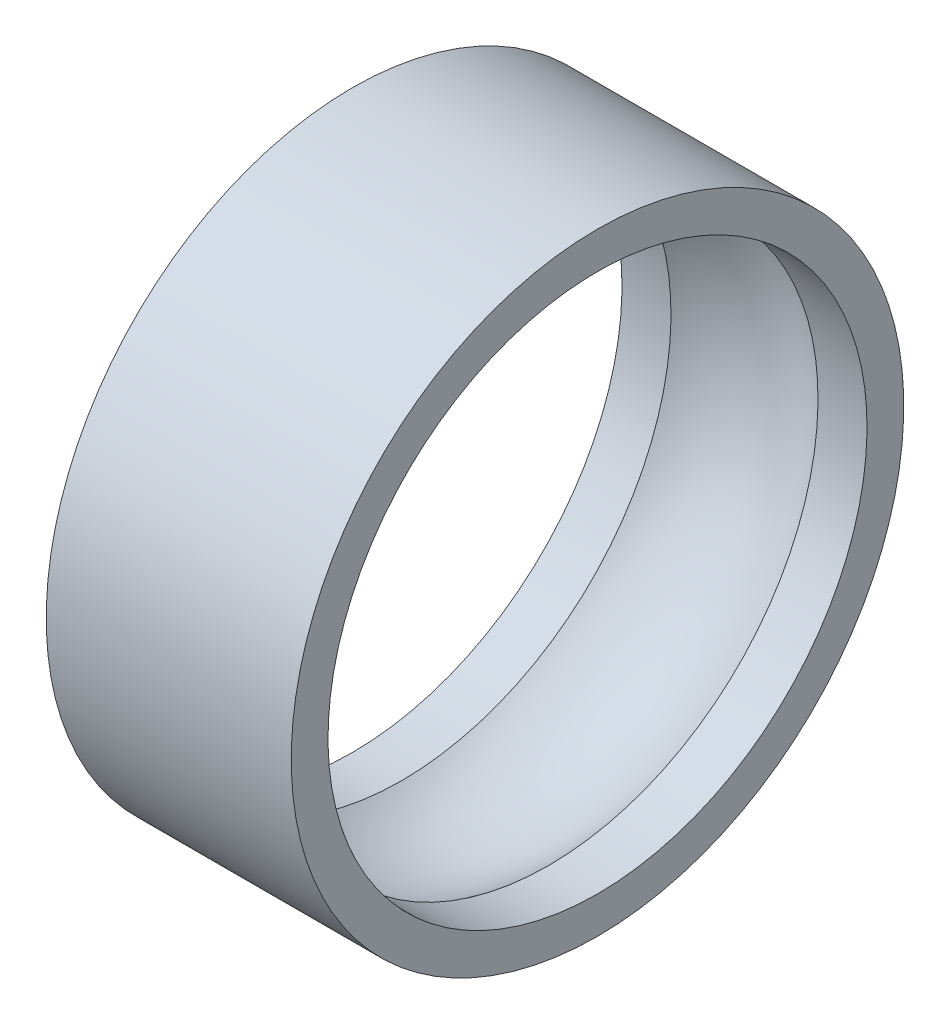
ISO-10303-21;
HEADER;
FILE_DESCRIPTION(('STEP AP214'),'2;1');
FILE_NAME('part.step','',(''),(''),'','','');
FILE_SCHEMA(('AUTOMOTIVE_DESIGN { 1 0 10303 214 1 1 1 1 }'));
ENDSEC;
DATA;
#1=APPLICATION_CONTEXT('core data for automotive mechanical design processes');
#2=APPLICATION_PROTOCOL_DEFINITION('international standard','automotive_design',2000,#1);
#3=PRODUCT_CONTEXT('',#1,'mechanical');
#4=PRODUCT('Part','Part','',(#3));
#5=PRODUCT_RELATED_PRODUCT_CATEGORY('part','',(#4));
#6=PRODUCT_DEFINITION_FORMATION('','',#4);
#7=PRODUCT_DEFINITION_CONTEXT('part definition',#1,'design');
#8=PRODUCT_DEFINITION('design','',#6,#7);
#9=PRODUCT_DEFINITION_SHAPE('','',#8);
#10=(LENGTH_UNIT() NAMED_UNIT(*) SI_UNIT(.MILLI.,.METRE.));
#11=(NAMED_UNIT(*) PLANE_ANGLE_UNIT() SI_UNIT($,.RADIAN.));
#12=(NAMED_UNIT(*) SI_UNIT($,.STERADIAN.) SOLID_ANGLE_UNIT());
#13=UNCERTAINTY_MEASURE_WITH_UNIT(LENGTH_MEASURE(1.E-05),#10,'distance_accuracy_value','');
#14=(GEOMETRIC_REPRESENTATION_CONTEXT(3) GLOBAL_UNCERTAINTY_ASSIGNED_CONTEXT((#13)) GLOBAL_UNIT_ASSIGNED_CONTEXT((#10,
#11,#12)) REPRESENTATION_CONTEXT('',''));
#15=CARTESIAN_POINT('',(0.,0.,0.));
#16=DIRECTION('',(0.,0.,1.));
#17=DIRECTION('',(1.,0.,0.));
#18=AXIS2_PLACEMENT_3D('',#15,#16,#17);
#19=CARTESIAN_POINT('',(-10.,0.,0.));
#20=DIRECTION('',(-1.,0.,0.));
#21=DIRECTION('',(0.,-1.,0.));
#22=AXIS2_PLACEMENT_3D('',#19,#20,#21);
#23=CYLINDRICAL_SURFACE('',#22,22.);
#24=CARTESIAN_POINT('',(-6.00000000000001,0.,0.));
#25=DIRECTION('',(-1.,0.,0.));
#26=DIRECTION('',(0.,-1.,0.));
#27=AXIS2_PLACEMENT_3D('',#24,#25,#26);
#28=CIRCLE('',#27,22.);
#29=CARTESIAN_POINT('',(-6.00000000000001,-22.,0.));
#30=VERTEX_POINT('',#29);
#31=EDGE_CURVE('E56',#30,#30,#28,.T.);
#32=ORIENTED_EDGE('',*,*,#31,.F.);
#33=EDGE_LOOP('',(#32));
#34=FACE_BOUND('',#33,.T.);
#35=CARTESIAN_POINT('',(-10.,0.,0.));
#36=DIRECTION('',(-1.,0.,0.));
#37=DIRECTION('',(0.,-1.,0.));
#38=AXIS2_PLACEMENT_3D('',#35,#36,#37);
#39=CIRCLE('',#38,22.);
#40=CARTESIAN_POINT('',(-10.,-22.,0.));
#41=VERTEX_POINT('',#40);
#42=EDGE_CURVE('E10',#41,#41,#39,.T.);
#43=ORIENTED_EDGE('',*,*,#42,.T.);
#44=EDGE_LOOP('',(#43));
#45=FACE_BOUND('',#44,.T.);
#46=ADVANCED_FACE('F40',(#34,#45),#23,.F.);
#47=CARTESIAN_POINT('',(-10.,25.,0.));
#48=DIRECTION('',(1.,0.,0.));
#49=DIRECTION('',(0.,1.,0.));
#50=AXIS2_PLACEMENT_3D('',#47,#48,#49);
#51=PLANE('',#50);
#52=ORIENTED_EDGE('',*,*,#42,.F.);
#53=EDGE_LOOP('',(#52));
#54=FACE_BOUND('',#53,.T.);
#55=CARTESIAN_POINT('',(-10.,0.,0.));
#56=DIRECTION('',(-1.,0.,0.));
#57=DIRECTION('',(0.,-1.,0.));
#58=AXIS2_PLACEMENT_3D('',#55,#56,#57);
#59=CIRCLE('',#58,25.);
#60=CARTESIAN_POINT('',(-10.,-25.,0.));
#61=VERTEX_POINT('',#60);
#62=EDGE_CURVE('E43',#61,#61,#59,.T.);
#63=ORIENTED_EDGE('',*,*,#62,.T.);
#64=EDGE_LOOP('',(#63));
#65=FACE_BOUND('',#64,.T.);
#66=ADVANCED_FACE('F67',(#54,#65),#51,.F.);
#67=CARTESIAN_POINT('',(-10.,0.,0.));
#68=DIRECTION('',(-1.,0.,0.));
#69=DIRECTION('',(0.,-1.,0.));
#70=AXIS2_PLACEMENT_3D('',#67,#68,#69);
#71=CYLINDRICAL_SURFACE('',#70,25.);
#72=ORIENTED_EDGE('',*,*,#62,.F.);
#73=EDGE_LOOP('',(#72));
#74=FACE_BOUND('',#73,.T.);
#75=CARTESIAN_POINT('',(10.,0.,0.));
#76=DIRECTION('',(-1.,0.,0.));
#77=DIRECTION('',(0.,-1.,0.));
#78=AXIS2_PLACEMENT_3D('',#75,#76,#77);
#79=CIRCLE('',#78,25.);
#80=CARTESIAN_POINT('',(10.,-25.,0.));
#81=VERTEX_POINT('',#80);
#82=EDGE_CURVE('E50',#81,#81,#79,.T.);
#83=ORIENTED_EDGE('',*,*,#82,.T.);
#84=EDGE_LOOP('',(#83));
#85=FACE_BOUND('',#84,.T.);
#86=ADVANCED_FACE('F68',(#74,#85),#71,.T.);
#87=CARTESIAN_POINT('',(10.,25.,0.));
#88=DIRECTION('',(-1.,0.,0.));
#89=DIRECTION('',(0.,-1.,0.));
#90=AXIS2_PLACEMENT_3D('',#87,#88,#89);
#91=PLANE('',#90);
#92=ORIENTED_EDGE('',*,*,#82,.F.);
#93=EDGE_LOOP('',(#92));
#94=FACE_BOUND('',#93,.T.);
#95=CARTESIAN_POINT('',(10.,0.,0.));
#96=DIRECTION('',(-1.,0.,0.));
#97=DIRECTION('',(0.,-1.,0.));
#98=AXIS2_PLACEMENT_3D('',#95,#96,#97);
#99=CIRCLE('',#98,22.);
#100=CARTESIAN_POINT('',(10.,-22.,0.));
#101=VERTEX_POINT('',#100);
#102=EDGE_CURVE('E51',#101,#101,#99,.T.);
#103=ORIENTED_EDGE('',*,*,#102,.T.);
#104=EDGE_LOOP('',(#103));
#105=FACE_BOUND('',#104,.T.);
#106=ADVANCED_FACE('F73',(#94,#105),#91,.F.);
#107=CARTESIAN_POINT('',(-10.,0.,0.));
#108=DIRECTION('',(-1.,0.,0.));
#109=DIRECTION('',(0.,-1.,0.));
#110=AXIS2_PLACEMENT_3D('',#107,#108,#109);
#111=CYLINDRICAL_SURFACE('',#110,22.);
#112=ORIENTED_EDGE('',*,*,#102,.F.);
#113=EDGE_LOOP('',(#112));
#114=FACE_BOUND('',#113,.T.);
#115=CARTESIAN_POINT('',(6.00000000000001,0.,0.));
#116=DIRECTION('',(-1.,0.,0.));
#117=DIRECTION('',(0.,-1.,0.));
#118=AXIS2_PLACEMENT_3D('',#115,#116,#117);
#119=CIRCLE('',#118,22.);
#120=CARTESIAN_POINT('',(6.00000000000001,-22.,0.));
#121=VERTEX_POINT('',#120);
#122=EDGE_CURVE('E57',#121,#121,#119,.T.);
#123=ORIENTED_EDGE('',*,*,#122,.T.);
#124=EDGE_LOOP('',(#123));
#125=FACE_BOUND('',#124,.T.);
#126=ADVANCED_FACE('F83',(#114,#125),#111,.F.);
#127=CARTESIAN_POINT('',(0.,0.,0.));
#128=DIRECTION('',(-1.,0.,0.));
#129=DIRECTION('',(0.,-1.,0.));
#130=AXIS2_PLACEMENT_3D('',#127,#128,#129);
#131=TOROIDAL_SURFACE('',#130,14.,10.);
#132=ORIENTED_EDGE('',*,*,#122,.F.);
#133=EDGE_LOOP('',(#132));
#134=FACE_BOUND('',#133,.T.);
#135=ORIENTED_EDGE('',*,*,#31,.T.);
#136=EDGE_LOOP('',(#135));
#137=FACE_BOUND('',#136,.T.);
#138=ADVANCED_FACE('F65',(#134,#137),#131,.F.);
#139=CLOSED_SHELL('',(#46,#66,#86,#106,#126,#138));
#140=MANIFOLD_SOLID_BREP('B2',#139);
#141=ADVANCED_BREP_SHAPE_REPRESENTATION('',(#18,#140),#14);
#142=SHAPE_DEFINITION_REPRESENTATION(#9,#141);
ENDSEC;
END-ISO-10303-21;
